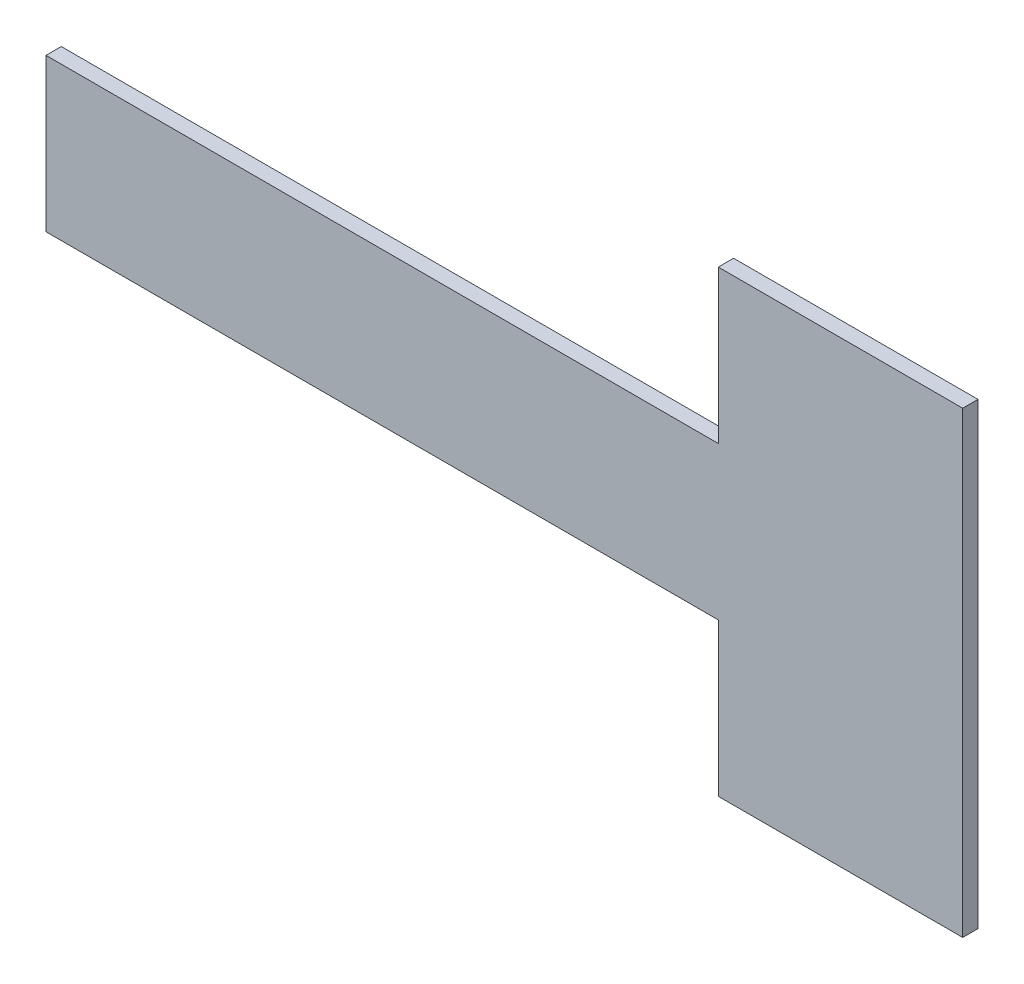
ISO-10303-21;
HEADER;
FILE_DESCRIPTION(('STEP AP214'),'2;1');
FILE_NAME('part.step','',(''),(''),'','','');
FILE_SCHEMA(('AUTOMOTIVE_DESIGN { 1 0 10303 214 1 1 1 1 }'));
ENDSEC;
DATA;
#1=APPLICATION_CONTEXT('core data for automotive mechanical design processes');
#2=APPLICATION_PROTOCOL_DEFINITION('international standard','automotive_design',2000,#1);
#3=PRODUCT_CONTEXT('',#1,'mechanical');
#4=PRODUCT('Part','Part','',(#3));
#5=PRODUCT_RELATED_PRODUCT_CATEGORY('part','',(#4));
#6=PRODUCT_DEFINITION_FORMATION('','',#4);
#7=PRODUCT_DEFINITION_CONTEXT('part definition',#1,'design');
#8=PRODUCT_DEFINITION('design','',#6,#7);
#9=PRODUCT_DEFINITION_SHAPE('','',#8);
#10=(LENGTH_UNIT() NAMED_UNIT(*) SI_UNIT(.MILLI.,.METRE.));
#11=(NAMED_UNIT(*) PLANE_ANGLE_UNIT() SI_UNIT($,.RADIAN.));
#12=(NAMED_UNIT(*) SI_UNIT($,.STERADIAN.) SOLID_ANGLE_UNIT());
#13=UNCERTAINTY_MEASURE_WITH_UNIT(LENGTH_MEASURE(1.E-05),#10,'distance_accuracy_value','');
#14=(GEOMETRIC_REPRESENTATION_CONTEXT(3) GLOBAL_UNCERTAINTY_ASSIGNED_CONTEXT((#13)) GLOBAL_UNIT_ASSIGNED_CONTEXT((#10,
#11,#12)) REPRESENTATION_CONTEXT('',''));
#15=CARTESIAN_POINT('',(0.,0.,0.));
#16=DIRECTION('',(0.,0.,1.));
#17=DIRECTION('',(1.,0.,0.));
#18=AXIS2_PLACEMENT_3D('',#15,#16,#17);
#19=CARTESIAN_POINT('',(0.,-12.7,1.27));
#20=DIRECTION('',(0.,1.,0.));
#21=DIRECTION('',(0.,0.,1.));
#22=AXIS2_PLACEMENT_3D('',#19,#20,#21);
#23=PLANE('',#22);
#24=DIRECTION('',(0.,0.,-1.));
#25=VECTOR('',#24,1.);
#26=CARTESIAN_POINT('',(55.88,-12.7,1.27));
#27=LINE('',#26,#25);
#28=CARTESIAN_POINT('',(55.88,-12.7,1.27));
#29=VERTEX_POINT('',#28);
#30=CARTESIAN_POINT('',(55.88,-12.7,0.));
#31=VERTEX_POINT('',#30);
#32=EDGE_CURVE('E48',#29,#31,#27,.T.);
#33=ORIENTED_EDGE('',*,*,#32,.F.);
#34=DIRECTION('',(1.,0.,0.));
#35=VECTOR('',#34,1.);
#36=CARTESIAN_POINT('',(0.,-12.7,1.27));
#37=LINE('',#36,#35);
#38=CARTESIAN_POINT('',(0.,-12.7,1.27));
#39=VERTEX_POINT('',#38);
#40=EDGE_CURVE('E116',#39,#29,#37,.T.);
#41=ORIENTED_EDGE('',*,*,#40,.F.);
#42=DIRECTION('',(0.,0.,-1.));
#43=VECTOR('',#42,1.);
#44=CARTESIAN_POINT('',(0.,-12.7,1.27));
#45=LINE('',#44,#43);
#46=CARTESIAN_POINT('',(0.,-12.7,0.));
#47=VERTEX_POINT('',#46);
#48=EDGE_CURVE('E11',#39,#47,#45,.T.);
#49=ORIENTED_EDGE('',*,*,#48,.T.);
#50=DIRECTION('',(1.,0.,0.));
#51=VECTOR('',#50,1.);
#52=CARTESIAN_POINT('',(0.,-12.7,0.));
#53=LINE('',#52,#51);
#54=EDGE_CURVE('E154',#47,#31,#53,.T.);
#55=ORIENTED_EDGE('',*,*,#54,.T.);
#56=EDGE_LOOP('',(#33,#41,#49,#55));
#57=FACE_BOUND('',#56,.T.);
#58=ADVANCED_FACE('F33',(#57),#23,.F.);
#59=CARTESIAN_POINT('',(0.,0.,1.27));
#60=DIRECTION('',(1.,0.,0.));
#61=DIRECTION('',(0.,0.,-1.));
#62=AXIS2_PLACEMENT_3D('',#59,#60,#61);
#63=PLANE('',#62);
#64=DIRECTION('',(0.,-1.,0.));
#65=VECTOR('',#64,1.);
#66=CARTESIAN_POINT('',(0.,0.,0.));
#67=LINE('',#66,#65);
#68=CARTESIAN_POINT('',(0.,0.,0.));
#69=VERTEX_POINT('',#68);
#70=EDGE_CURVE('E139',#69,#47,#67,.T.);
#71=ORIENTED_EDGE('',*,*,#70,.T.);
#72=ORIENTED_EDGE('',*,*,#48,.F.);
#73=DIRECTION('',(0.,-1.,0.));
#74=VECTOR('',#73,1.);
#75=CARTESIAN_POINT('',(0.,0.,1.27));
#76=LINE('',#75,#74);
#77=CARTESIAN_POINT('',(0.,0.,1.27));
#78=VERTEX_POINT('',#77);
#79=EDGE_CURVE('E144',#78,#39,#76,.T.);
#80=ORIENTED_EDGE('',*,*,#79,.F.);
#81=DIRECTION('',(0.,0.,-1.));
#82=VECTOR('',#81,1.);
#83=CARTESIAN_POINT('',(0.,0.,1.27));
#84=LINE('',#83,#82);
#85=EDGE_CURVE('E41',#78,#69,#84,.T.);
#86=ORIENTED_EDGE('',*,*,#85,.T.);
#87=EDGE_LOOP('',(#71,#72,#80,#86));
#88=FACE_BOUND('',#87,.T.);
#89=ADVANCED_FACE('F35',(#88),#63,.F.);
#90=CARTESIAN_POINT('',(76.2,0.,1.27));
#91=DIRECTION('',(-1.,0.,0.));
#92=DIRECTION('',(0.,0.,1.));
#93=AXIS2_PLACEMENT_3D('',#90,#91,#92);
#94=PLANE('',#93);
#95=DIRECTION('',(0.,1.,0.));
#96=VECTOR('',#95,1.);
#97=CARTESIAN_POINT('',(76.2,0.,0.));
#98=LINE('',#97,#96);
#99=CARTESIAN_POINT('',(76.2,-25.4,0.));
#100=VERTEX_POINT('',#99);
#101=CARTESIAN_POINT('',(76.2,12.7,0.));
#102=VERTEX_POINT('',#101);
#103=EDGE_CURVE('E156',#100,#102,#98,.T.);
#104=ORIENTED_EDGE('',*,*,#103,.T.);
#105=DIRECTION('',(0.,0.,-1.));
#106=VECTOR('',#105,1.);
#107=CARTESIAN_POINT('',(76.2,12.7,1.27));
#108=LINE('',#107,#106);
#109=CARTESIAN_POINT('',(76.2,12.7,1.27));
#110=VERTEX_POINT('',#109);
#111=EDGE_CURVE('E140',#110,#102,#108,.T.);
#112=ORIENTED_EDGE('',*,*,#111,.F.);
#113=DIRECTION('',(0.,1.,0.));
#114=VECTOR('',#113,1.);
#115=CARTESIAN_POINT('',(76.2,0.,1.27));
#116=LINE('',#115,#114);
#117=CARTESIAN_POINT('',(76.2,-25.4,1.27));
#118=VERTEX_POINT('',#117);
#119=EDGE_CURVE('E148',#118,#110,#116,.T.);
#120=ORIENTED_EDGE('',*,*,#119,.F.);
#121=DIRECTION('',(0.,0.,-1.));
#122=VECTOR('',#121,1.);
#123=CARTESIAN_POINT('',(76.2,-25.4,1.27));
#124=LINE('',#123,#122);
#125=EDGE_CURVE('E121',#118,#100,#124,.T.);
#126=ORIENTED_EDGE('',*,*,#125,.T.);
#127=EDGE_LOOP('',(#104,#112,#120,#126));
#128=FACE_BOUND('',#127,.T.);
#129=ADVANCED_FACE('F179',(#128),#94,.F.);
#130=CARTESIAN_POINT('',(0.,0.,1.27));
#131=DIRECTION('',(0.,-1.,0.));
#132=DIRECTION('',(0.,0.,-1.));
#133=AXIS2_PLACEMENT_3D('',#130,#131,#132);
#134=PLANE('',#133);
#135=DIRECTION('',(-1.,0.,0.));
#136=VECTOR('',#135,1.);
#137=CARTESIAN_POINT('',(0.,0.,1.27));
#138=LINE('',#137,#136);
#139=CARTESIAN_POINT('',(55.88,0.,1.27));
#140=VERTEX_POINT('',#139);
#141=EDGE_CURVE('E150',#140,#78,#138,.T.);
#142=ORIENTED_EDGE('',*,*,#141,.F.);
#143=DIRECTION('',(0.,0.,-1.));
#144=VECTOR('',#143,1.);
#145=CARTESIAN_POINT('',(55.88,0.,1.27));
#146=LINE('',#145,#144);
#147=CARTESIAN_POINT('',(55.88,0.,0.));
#148=VERTEX_POINT('',#147);
#149=EDGE_CURVE('E137',#140,#148,#146,.T.);
#150=ORIENTED_EDGE('',*,*,#149,.T.);
#151=DIRECTION('',(-1.,0.,0.));
#152=VECTOR('',#151,1.);
#153=CARTESIAN_POINT('',(0.,0.,0.));
#154=LINE('',#153,#152);
#155=EDGE_CURVE('E146',#148,#69,#154,.T.);
#156=ORIENTED_EDGE('',*,*,#155,.T.);
#157=ORIENTED_EDGE('',*,*,#85,.F.);
#158=EDGE_LOOP('',(#142,#150,#156,#157));
#159=FACE_BOUND('',#158,.T.);
#160=ADVANCED_FACE('F170',(#159),#134,.F.);
#161=CARTESIAN_POINT('',(0.,0.,1.27));
#162=DIRECTION('',(0.,0.,1.));
#163=DIRECTION('',(1.,0.,0.));
#164=AXIS2_PLACEMENT_3D('',#161,#162,#163);
#165=PLANE('',#164);
#166=ORIENTED_EDGE('',*,*,#79,.T.);
#167=ORIENTED_EDGE('',*,*,#40,.T.);
#168=DIRECTION('',(0.,1.,0.));
#169=VECTOR('',#168,1.);
#170=CARTESIAN_POINT('',(55.88,0.,1.27));
#171=LINE('',#170,#169);
#172=CARTESIAN_POINT('',(55.88,-25.4,1.27));
#173=VERTEX_POINT('',#172);
#174=EDGE_CURVE('E103',#173,#29,#171,.T.);
#175=ORIENTED_EDGE('',*,*,#174,.F.);
#176=DIRECTION('',(-1.,0.,0.));
#177=VECTOR('',#176,1.);
#178=CARTESIAN_POINT('',(0.,-25.4,1.27));
#179=LINE('',#178,#177);
#180=EDGE_CURVE('E115',#118,#173,#179,.T.);
#181=ORIENTED_EDGE('',*,*,#180,.F.);
#182=ORIENTED_EDGE('',*,*,#119,.T.);
#183=DIRECTION('',(-1.,0.,0.));
#184=VECTOR('',#183,1.);
#185=CARTESIAN_POINT('',(0.,12.7,1.27));
#186=LINE('',#185,#184);
#187=CARTESIAN_POINT('',(55.88,12.7,1.27));
#188=VERTEX_POINT('',#187);
#189=EDGE_CURVE('E131',#110,#188,#186,.T.);
#190=ORIENTED_EDGE('',*,*,#189,.T.);
#191=DIRECTION('',(0.,-1.,0.));
#192=VECTOR('',#191,1.);
#193=CARTESIAN_POINT('',(55.88,0.,1.27));
#194=LINE('',#193,#192);
#195=EDGE_CURVE('E129',#188,#140,#194,.T.);
#196=ORIENTED_EDGE('',*,*,#195,.T.);
#197=ORIENTED_EDGE('',*,*,#141,.T.);
#198=EDGE_LOOP('',(#166,#167,#175,#181,#182,#190,#196,#197));
#199=FACE_BOUND('',#198,.T.);
#200=ADVANCED_FACE('F114',(#199),#165,.T.);
#201=CARTESIAN_POINT('',(0.,0.,0.));
#202=DIRECTION('',(0.,0.,1.));
#203=DIRECTION('',(1.,0.,0.));
#204=AXIS2_PLACEMENT_3D('',#201,#202,#203);
#205=PLANE('',#204);
#206=ORIENTED_EDGE('',*,*,#70,.F.);
#207=ORIENTED_EDGE('',*,*,#155,.F.);
#208=DIRECTION('',(0.,-1.,0.));
#209=VECTOR('',#208,1.);
#210=CARTESIAN_POINT('',(55.88,0.,0.));
#211=LINE('',#210,#209);
#212=CARTESIAN_POINT('',(55.88,12.7,0.));
#213=VERTEX_POINT('',#212);
#214=EDGE_CURVE('E56',#213,#148,#211,.T.);
#215=ORIENTED_EDGE('',*,*,#214,.F.);
#216=DIRECTION('',(-1.,0.,0.));
#217=VECTOR('',#216,1.);
#218=CARTESIAN_POINT('',(0.,12.7,0.));
#219=LINE('',#218,#217);
#220=EDGE_CURVE('E132',#102,#213,#219,.T.);
#221=ORIENTED_EDGE('',*,*,#220,.F.);
#222=ORIENTED_EDGE('',*,*,#103,.F.);
#223=DIRECTION('',(-1.,0.,0.));
#224=VECTOR('',#223,1.);
#225=CARTESIAN_POINT('',(0.,-25.4,0.));
#226=LINE('',#225,#224);
#227=CARTESIAN_POINT('',(55.88,-25.4,0.));
#228=VERTEX_POINT('',#227);
#229=EDGE_CURVE('E123',#100,#228,#226,.T.);
#230=ORIENTED_EDGE('',*,*,#229,.T.);
#231=DIRECTION('',(0.,1.,0.));
#232=VECTOR('',#231,1.);
#233=CARTESIAN_POINT('',(55.88,0.,0.));
#234=LINE('',#233,#232);
#235=EDGE_CURVE('E105',#228,#31,#234,.T.);
#236=ORIENTED_EDGE('',*,*,#235,.T.);
#237=ORIENTED_EDGE('',*,*,#54,.F.);
#238=EDGE_LOOP('',(#206,#207,#215,#221,#222,#230,#236,#237));
#239=FACE_BOUND('',#238,.T.);
#240=ADVANCED_FACE('F168',(#239),#205,.F.);
#241=CARTESIAN_POINT('',(55.88,0.,1.27));
#242=DIRECTION('',(1.,0.,0.));
#243=DIRECTION('',(0.,0.,-1.));
#244=AXIS2_PLACEMENT_3D('',#241,#242,#243);
#245=PLANE('',#244);
#246=ORIENTED_EDGE('',*,*,#214,.T.);
#247=ORIENTED_EDGE('',*,*,#149,.F.);
#248=ORIENTED_EDGE('',*,*,#195,.F.);
#249=DIRECTION('',(0.,0.,-1.));
#250=VECTOR('',#249,1.);
#251=CARTESIAN_POINT('',(55.88,12.7,1.27));
#252=LINE('',#251,#250);
#253=EDGE_CURVE('E134',#188,#213,#252,.T.);
#254=ORIENTED_EDGE('',*,*,#253,.T.);
#255=EDGE_LOOP('',(#246,#247,#248,#254));
#256=FACE_BOUND('',#255,.T.);
#257=ADVANCED_FACE('F171',(#256),#245,.F.);
#258=CARTESIAN_POINT('',(0.,12.7,1.27));
#259=DIRECTION('',(0.,-1.,0.));
#260=DIRECTION('',(0.,0.,-1.));
#261=AXIS2_PLACEMENT_3D('',#258,#259,#260);
#262=PLANE('',#261);
#263=ORIENTED_EDGE('',*,*,#220,.T.);
#264=ORIENTED_EDGE('',*,*,#253,.F.);
#265=ORIENTED_EDGE('',*,*,#189,.F.);
#266=ORIENTED_EDGE('',*,*,#111,.T.);
#267=EDGE_LOOP('',(#263,#264,#265,#266));
#268=FACE_BOUND('',#267,.T.);
#269=ADVANCED_FACE('F176',(#268),#262,.F.);
#270=CARTESIAN_POINT('',(0.,-25.4,1.27));
#271=DIRECTION('',(0.,-1.,0.));
#272=DIRECTION('',(0.,0.,-1.));
#273=AXIS2_PLACEMENT_3D('',#270,#271,#272);
#274=PLANE('',#273);
#275=ORIENTED_EDGE('',*,*,#229,.F.);
#276=ORIENTED_EDGE('',*,*,#125,.F.);
#277=ORIENTED_EDGE('',*,*,#180,.T.);
#278=DIRECTION('',(0.,0.,-1.));
#279=VECTOR('',#278,1.);
#280=CARTESIAN_POINT('',(55.88,-25.4,1.27));
#281=LINE('',#280,#279);
#282=EDGE_CURVE('E100',#173,#228,#281,.T.);
#283=ORIENTED_EDGE('',*,*,#282,.T.);
#284=EDGE_LOOP('',(#275,#276,#277,#283));
#285=FACE_BOUND('',#284,.T.);
#286=ADVANCED_FACE('F119',(#285),#274,.T.);
#287=CARTESIAN_POINT('',(55.88,0.,1.27));
#288=DIRECTION('',(-1.,0.,0.));
#289=DIRECTION('',(0.,0.,1.));
#290=AXIS2_PLACEMENT_3D('',#287,#288,#289);
#291=PLANE('',#290);
#292=ORIENTED_EDGE('',*,*,#235,.F.);
#293=ORIENTED_EDGE('',*,*,#282,.F.);
#294=ORIENTED_EDGE('',*,*,#174,.T.);
#295=ORIENTED_EDGE('',*,*,#32,.T.);
#296=EDGE_LOOP('',(#292,#293,#294,#295));
#297=FACE_BOUND('',#296,.T.);
#298=ADVANCED_FACE('F102',(#297),#291,.T.);
#299=CLOSED_SHELL('',(#58,#89,#129,#160,#200,#240,#257,#269,#286,#298));
#300=MANIFOLD_SOLID_BREP('B2',#299);
#301=ADVANCED_BREP_SHAPE_REPRESENTATION('',(#18,#300),#14);
#302=SHAPE_DEFINITION_REPRESENTATION(#9,#301);
ENDSEC;
END-ISO-10303-21;
